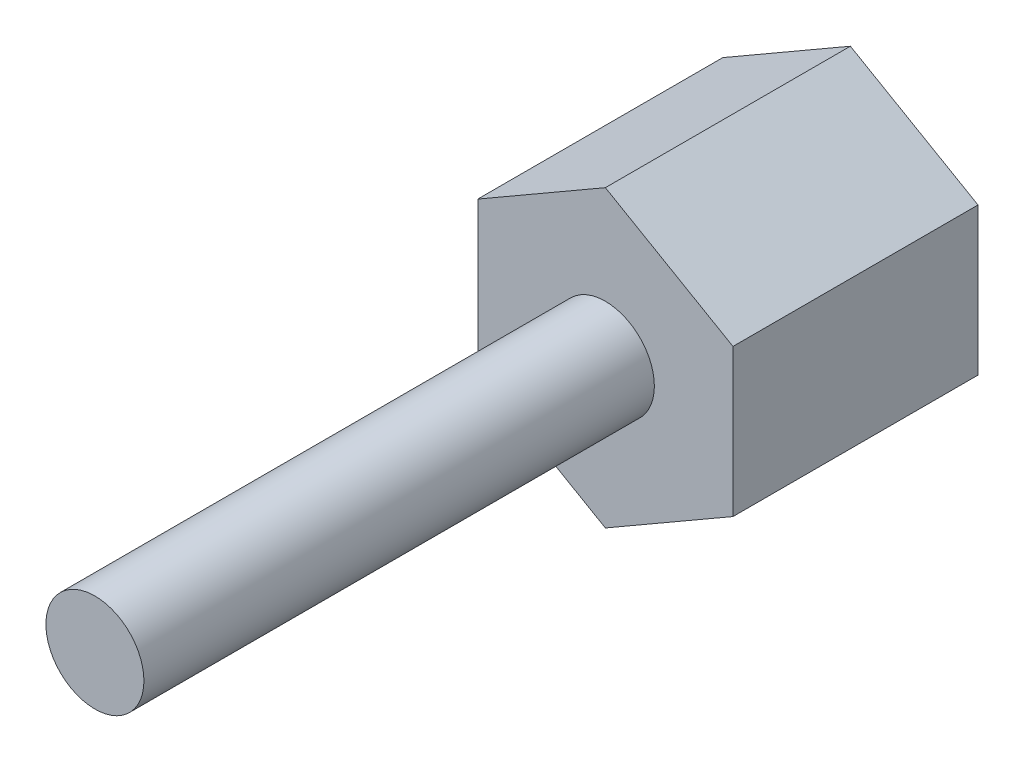
ISO-10303-21;
HEADER;
FILE_DESCRIPTION(('STEP AP214'),'2;1');
FILE_NAME('part.step','',(''),(''),'','','');
FILE_SCHEMA(('AUTOMOTIVE_DESIGN { 1 0 10303 214 1 1 1 1 }'));
ENDSEC;
DATA;
#1=APPLICATION_CONTEXT('core data for automotive mechanical design processes');
#2=APPLICATION_PROTOCOL_DEFINITION('international standard','automotive_design',2000,#1);
#3=PRODUCT_CONTEXT('',#1,'mechanical');
#4=PRODUCT('Part','Part','',(#3));
#5=PRODUCT_RELATED_PRODUCT_CATEGORY('part','',(#4));
#6=PRODUCT_DEFINITION_FORMATION('','',#4);
#7=PRODUCT_DEFINITION_CONTEXT('part definition',#1,'design');
#8=PRODUCT_DEFINITION('design','',#6,#7);
#9=PRODUCT_DEFINITION_SHAPE('','',#8);
#10=(LENGTH_UNIT() NAMED_UNIT(*) SI_UNIT(.MILLI.,.METRE.));
#11=(NAMED_UNIT(*) PLANE_ANGLE_UNIT() SI_UNIT($,.RADIAN.));
#12=(NAMED_UNIT(*) SI_UNIT($,.STERADIAN.) SOLID_ANGLE_UNIT());
#13=UNCERTAINTY_MEASURE_WITH_UNIT(LENGTH_MEASURE(1.E-05),#10,'distance_accuracy_value','');
#14=(GEOMETRIC_REPRESENTATION_CONTEXT(3) GLOBAL_UNCERTAINTY_ASSIGNED_CONTEXT((#13)) GLOBAL_UNIT_ASSIGNED_CONTEXT((#10,
#11,#12)) REPRESENTATION_CONTEXT('',''));
#15=CARTESIAN_POINT('',(0.,0.,0.));
#16=DIRECTION('',(0.,0.,1.));
#17=DIRECTION('',(1.,0.,0.));
#18=AXIS2_PLACEMENT_3D('',#15,#16,#17);
#19=CARTESIAN_POINT('',(6.25,3.60843918243517,12.));
#20=DIRECTION('',(-0.5,-0.866025403784439,0.));
#21=DIRECTION('',(0.866025403784439,-0.5,0.));
#22=AXIS2_PLACEMENT_3D('',#19,#20,#21);
#23=PLANE('',#22);
#24=DIRECTION('',(-0.866025403784439,0.5,0.));
#25=VECTOR('',#24,1.);
#26=CARTESIAN_POINT('',(6.25,3.60843918243517,0.));
#27=LINE('',#26,#25);
#28=CARTESIAN_POINT('',(6.25,3.60843918243517,0.));
#29=VERTEX_POINT('',#28);
#30=CARTESIAN_POINT('',(0.,7.21687836487032,0.));
#31=VERTEX_POINT('',#30);
#32=EDGE_CURVE('E125',#29,#31,#27,.T.);
#33=ORIENTED_EDGE('',*,*,#32,.T.);
#34=DIRECTION('',(0.,0.,-1.));
#35=VECTOR('',#34,1.);
#36=CARTESIAN_POINT('',(0.,7.21687836487032,12.));
#37=LINE('',#36,#35);
#38=CARTESIAN_POINT('',(0.,7.21687836487032,12.));
#39=VERTEX_POINT('',#38);
#40=EDGE_CURVE('E42',#39,#31,#37,.T.);
#41=ORIENTED_EDGE('',*,*,#40,.F.);
#42=DIRECTION('',(-0.866025403784439,0.5,0.));
#43=VECTOR('',#42,1.);
#44=CARTESIAN_POINT('',(6.25,3.60843918243517,12.));
#45=LINE('',#44,#43);
#46=CARTESIAN_POINT('',(6.25,3.60843918243517,12.));
#47=VERTEX_POINT('',#46);
#48=EDGE_CURVE('E136',#47,#39,#45,.T.);
#49=ORIENTED_EDGE('',*,*,#48,.F.);
#50=DIRECTION('',(0.,0.,-1.));
#51=VECTOR('',#50,1.);
#52=CARTESIAN_POINT('',(6.25,3.60843918243517,12.));
#53=LINE('',#52,#51);
#54=EDGE_CURVE('E121',#47,#29,#53,.T.);
#55=ORIENTED_EDGE('',*,*,#54,.T.);
#56=EDGE_LOOP('',(#33,#41,#49,#55));
#57=FACE_BOUND('',#56,.T.);
#58=ADVANCED_FACE('F39',(#57),#23,.F.);
#59=CARTESIAN_POINT('',(0.,7.21687836487032,12.));
#60=DIRECTION('',(0.5,-0.866025403784439,0.));
#61=DIRECTION('',(0.866025403784439,0.5,0.));
#62=AXIS2_PLACEMENT_3D('',#59,#60,#61);
#63=PLANE('',#62);
#64=DIRECTION('',(-0.866025403784439,-0.5,0.));
#65=VECTOR('',#64,1.);
#66=CARTESIAN_POINT('',(0.,7.21687836487032,0.));
#67=LINE('',#66,#65);
#68=CARTESIAN_POINT('',(-6.25,3.60843918243516,0.));
#69=VERTEX_POINT('',#68);
#70=EDGE_CURVE('E128',#31,#69,#67,.T.);
#71=ORIENTED_EDGE('',*,*,#70,.T.);
#72=DIRECTION('',(0.,0.,-1.));
#73=VECTOR('',#72,1.);
#74=CARTESIAN_POINT('',(-6.25,3.60843918243516,12.));
#75=LINE('',#74,#73);
#76=CARTESIAN_POINT('',(-6.25,3.60843918243516,12.));
#77=VERTEX_POINT('',#76);
#78=EDGE_CURVE('E139',#77,#69,#75,.T.);
#79=ORIENTED_EDGE('',*,*,#78,.F.);
#80=DIRECTION('',(-0.866025403784439,-0.5,0.));
#81=VECTOR('',#80,1.);
#82=CARTESIAN_POINT('',(0.,7.21687836487032,12.));
#83=LINE('',#82,#81);
#84=EDGE_CURVE('E94',#39,#77,#83,.T.);
#85=ORIENTED_EDGE('',*,*,#84,.F.);
#86=ORIENTED_EDGE('',*,*,#40,.T.);
#87=EDGE_LOOP('',(#71,#79,#85,#86));
#88=FACE_BOUND('',#87,.T.);
#89=ADVANCED_FACE('F144',(#88),#63,.F.);
#90=CARTESIAN_POINT('',(-6.25,3.60843918243516,12.));
#91=DIRECTION('',(1.,0.,0.));
#92=DIRECTION('',(0.,1.,0.));
#93=AXIS2_PLACEMENT_3D('',#90,#91,#92);
#94=PLANE('',#93);
#95=DIRECTION('',(0.,-1.,0.));
#96=VECTOR('',#95,1.);
#97=CARTESIAN_POINT('',(-6.25,3.60843918243516,0.));
#98=LINE('',#97,#96);
#99=CARTESIAN_POINT('',(-6.25,-3.60843918243516,0.));
#100=VERTEX_POINT('',#99);
#101=EDGE_CURVE('E131',#69,#100,#98,.T.);
#102=ORIENTED_EDGE('',*,*,#101,.T.);
#103=DIRECTION('',(0.,0.,-1.));
#104=VECTOR('',#103,1.);
#105=CARTESIAN_POINT('',(-6.25,-3.60843918243516,12.));
#106=LINE('',#105,#104);
#107=CARTESIAN_POINT('',(-6.25,-3.60843918243516,12.));
#108=VERTEX_POINT('',#107);
#109=EDGE_CURVE('E116',#108,#100,#106,.T.);
#110=ORIENTED_EDGE('',*,*,#109,.F.);
#111=DIRECTION('',(0.,-1.,0.));
#112=VECTOR('',#111,1.);
#113=CARTESIAN_POINT('',(-6.25,3.60843918243516,12.));
#114=LINE('',#113,#112);
#115=EDGE_CURVE('E107',#77,#108,#114,.T.);
#116=ORIENTED_EDGE('',*,*,#115,.F.);
#117=ORIENTED_EDGE('',*,*,#78,.T.);
#118=EDGE_LOOP('',(#102,#110,#116,#117));
#119=FACE_BOUND('',#118,.T.);
#120=ADVANCED_FACE('F150',(#119),#94,.F.);
#121=CARTESIAN_POINT('',(-6.25,-3.60843918243516,12.));
#122=DIRECTION('',(0.5,0.866025403784439,0.));
#123=DIRECTION('',(-0.866025403784439,0.5,0.));
#124=AXIS2_PLACEMENT_3D('',#121,#122,#123);
#125=PLANE('',#124);
#126=DIRECTION('',(0.866025403784439,-0.5,0.));
#127=VECTOR('',#126,1.);
#128=CARTESIAN_POINT('',(-6.25,-3.60843918243516,0.));
#129=LINE('',#128,#127);
#130=CARTESIAN_POINT('',(0.,-7.21687836487032,0.));
#131=VERTEX_POINT('',#130);
#132=EDGE_CURVE('E115',#100,#131,#129,.T.);
#133=ORIENTED_EDGE('',*,*,#132,.T.);
#134=DIRECTION('',(0.,0.,-1.));
#135=VECTOR('',#134,1.);
#136=CARTESIAN_POINT('',(0.,-7.21687836487032,12.));
#137=LINE('',#136,#135);
#138=CARTESIAN_POINT('',(0.,-7.21687836487032,12.));
#139=VERTEX_POINT('',#138);
#140=EDGE_CURVE('E112',#139,#131,#137,.T.);
#141=ORIENTED_EDGE('',*,*,#140,.F.);
#142=DIRECTION('',(0.866025403784439,-0.5,0.));
#143=VECTOR('',#142,1.);
#144=CARTESIAN_POINT('',(-6.25,-3.60843918243516,12.));
#145=LINE('',#144,#143);
#146=EDGE_CURVE('E101',#108,#139,#145,.T.);
#147=ORIENTED_EDGE('',*,*,#146,.F.);
#148=ORIENTED_EDGE('',*,*,#109,.T.);
#149=EDGE_LOOP('',(#133,#141,#147,#148));
#150=FACE_BOUND('',#149,.T.);
#151=ADVANCED_FACE('F113',(#150),#125,.F.);
#152=CARTESIAN_POINT('',(0.,-7.21687836487032,12.));
#153=DIRECTION('',(-0.5,0.866025403784439,0.));
#154=DIRECTION('',(-0.866025403784439,-0.5,0.));
#155=AXIS2_PLACEMENT_3D('',#152,#153,#154);
#156=PLANE('',#155);
#157=DIRECTION('',(0.866025403784439,0.5,0.));
#158=VECTOR('',#157,1.);
#159=CARTESIAN_POINT('',(0.,-7.21687836487032,0.));
#160=LINE('',#159,#158);
#161=CARTESIAN_POINT('',(6.25,-3.60843918243516,0.));
#162=VERTEX_POINT('',#161);
#163=EDGE_CURVE('E79',#131,#162,#160,.T.);
#164=ORIENTED_EDGE('',*,*,#163,.T.);
#165=DIRECTION('',(0.,0.,-1.));
#166=VECTOR('',#165,1.);
#167=CARTESIAN_POINT('',(6.25,-3.60843918243516,12.));
#168=LINE('',#167,#166);
#169=CARTESIAN_POINT('',(6.25,-3.60843918243516,12.));
#170=VERTEX_POINT('',#169);
#171=EDGE_CURVE('E117',#170,#162,#168,.T.);
#172=ORIENTED_EDGE('',*,*,#171,.F.);
#173=DIRECTION('',(0.866025403784439,0.5,0.));
#174=VECTOR('',#173,1.);
#175=CARTESIAN_POINT('',(0.,-7.21687836487032,12.));
#176=LINE('',#175,#174);
#177=EDGE_CURVE('E105',#139,#170,#176,.T.);
#178=ORIENTED_EDGE('',*,*,#177,.F.);
#179=ORIENTED_EDGE('',*,*,#140,.T.);
#180=EDGE_LOOP('',(#164,#172,#178,#179));
#181=FACE_BOUND('',#180,.T.);
#182=ADVANCED_FACE('F119',(#181),#156,.F.);
#183=CARTESIAN_POINT('',(6.25,-3.60843918243516,12.));
#184=DIRECTION('',(-1.,0.,0.));
#185=DIRECTION('',(0.,-1.,0.));
#186=AXIS2_PLACEMENT_3D('',#183,#184,#185);
#187=PLANE('',#186);
#188=DIRECTION('',(0.,1.,0.));
#189=VECTOR('',#188,1.);
#190=CARTESIAN_POINT('',(6.25,-3.60843918243516,0.));
#191=LINE('',#190,#189);
#192=EDGE_CURVE('E85',#162,#29,#191,.T.);
#193=ORIENTED_EDGE('',*,*,#192,.T.);
#194=ORIENTED_EDGE('',*,*,#54,.F.);
#195=DIRECTION('',(0.,1.,0.));
#196=VECTOR('',#195,1.);
#197=CARTESIAN_POINT('',(6.25,-3.60843918243516,12.));
#198=LINE('',#197,#196);
#199=EDGE_CURVE('E56',#170,#47,#198,.T.);
#200=ORIENTED_EDGE('',*,*,#199,.F.);
#201=ORIENTED_EDGE('',*,*,#171,.T.);
#202=EDGE_LOOP('',(#193,#194,#200,#201));
#203=FACE_BOUND('',#202,.T.);
#204=ADVANCED_FACE('F166',(#203),#187,.F.);
#205=CARTESIAN_POINT('',(0.,0.,12.));
#206=DIRECTION('',(0.,0.,1.));
#207=DIRECTION('',(1.,0.,0.));
#208=AXIS2_PLACEMENT_3D('',#205,#206,#207);
#209=PLANE('',#208);
#210=CARTESIAN_POINT('',(0.,0.,12.));
#211=DIRECTION('',(0.,0.,1.));
#212=DIRECTION('',(1.,0.,0.));
#213=AXIS2_PLACEMENT_3D('',#210,#211,#212);
#214=CIRCLE('',#213,2.4);
#215=CARTESIAN_POINT('',(2.4,0.,12.));
#216=VERTEX_POINT('',#215);
#217=EDGE_CURVE('E11',#216,#216,#214,.T.);
#218=ORIENTED_EDGE('',*,*,#217,.F.);
#219=EDGE_LOOP('',(#218));
#220=FACE_BOUND('',#219,.T.);
#221=ORIENTED_EDGE('',*,*,#48,.T.);
#222=ORIENTED_EDGE('',*,*,#84,.T.);
#223=ORIENTED_EDGE('',*,*,#115,.T.);
#224=ORIENTED_EDGE('',*,*,#146,.T.);
#225=ORIENTED_EDGE('',*,*,#177,.T.);
#226=ORIENTED_EDGE('',*,*,#199,.T.);
#227=EDGE_LOOP('',(#221,#222,#223,#224,#225,#226));
#228=FACE_BOUND('',#227,.T.);
#229=ADVANCED_FACE('F103',(#220,#228),#209,.T.);
#230=CARTESIAN_POINT('',(0.,0.,0.));
#231=DIRECTION('',(0.,0.,1.));
#232=DIRECTION('',(1.,0.,0.));
#233=AXIS2_PLACEMENT_3D('',#230,#231,#232);
#234=PLANE('',#233);
#235=ORIENTED_EDGE('',*,*,#32,.F.);
#236=ORIENTED_EDGE('',*,*,#192,.F.);
#237=ORIENTED_EDGE('',*,*,#163,.F.);
#238=ORIENTED_EDGE('',*,*,#132,.F.);
#239=ORIENTED_EDGE('',*,*,#101,.F.);
#240=ORIENTED_EDGE('',*,*,#70,.F.);
#241=EDGE_LOOP('',(#235,#236,#237,#238,#239,#240));
#242=FACE_BOUND('',#241,.T.);
#243=ADVANCED_FACE('F149',(#242),#234,.F.);
#244=CARTESIAN_POINT('',(0.,0.,37.));
#245=DIRECTION('',(0.,0.,-1.));
#246=DIRECTION('',(-1.,0.,0.));
#247=AXIS2_PLACEMENT_3D('',#244,#245,#246);
#248=CYLINDRICAL_SURFACE('',#247,2.4);
#249=CARTESIAN_POINT('',(0.,0.,37.));
#250=DIRECTION('',(0.,0.,1.));
#251=DIRECTION('',(1.,0.,0.));
#252=AXIS2_PLACEMENT_3D('',#249,#250,#251);
#253=CIRCLE('',#252,2.4);
#254=CARTESIAN_POINT('',(2.4,0.,37.));
#255=VERTEX_POINT('',#254);
#256=EDGE_CURVE('E129',#255,#255,#253,.T.);
#257=ORIENTED_EDGE('',*,*,#256,.F.);
#258=EDGE_LOOP('',(#257));
#259=FACE_BOUND('',#258,.T.);
#260=ORIENTED_EDGE('',*,*,#217,.T.);
#261=EDGE_LOOP('',(#260));
#262=FACE_BOUND('',#261,.T.);
#263=ADVANCED_FACE('F159',(#259,#262),#248,.T.);
#264=CARTESIAN_POINT('',(0.,0.,37.));
#265=DIRECTION('',(0.,0.,1.));
#266=DIRECTION('',(1.,0.,0.));
#267=AXIS2_PLACEMENT_3D('',#264,#265,#266);
#268=PLANE('',#267);
#269=ORIENTED_EDGE('',*,*,#256,.T.);
#270=EDGE_LOOP('',(#269));
#271=FACE_BOUND('',#270,.T.);
#272=ADVANCED_FACE('F157',(#271),#268,.T.);
#273=CLOSED_SHELL('',(#58,#89,#120,#151,#182,#204,#229,#243,#263,#272));
#274=MANIFOLD_SOLID_BREP('B2',#273);
#275=ADVANCED_BREP_SHAPE_REPRESENTATION('',(#18,#274),#14);
#276=SHAPE_DEFINITION_REPRESENTATION(#9,#275);
ENDSEC;
END-ISO-10303-21;
